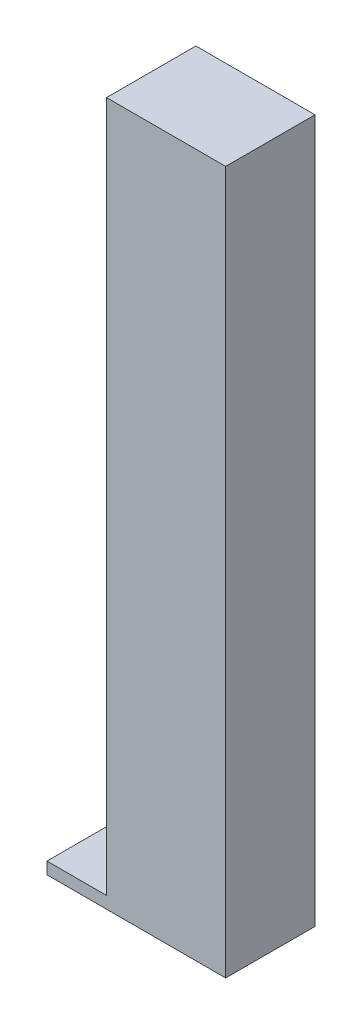
ISO-10303-21;
HEADER;
FILE_DESCRIPTION(('STEP AP214'),'2;1');
FILE_NAME('part.step','',(''),(''),'','','');
FILE_SCHEMA(('AUTOMOTIVE_DESIGN { 1 0 10303 214 1 1 1 1 }'));
ENDSEC;
DATA;
#1=APPLICATION_CONTEXT('core data for automotive mechanical design processes');
#2=APPLICATION_PROTOCOL_DEFINITION('international standard','automotive_design',2000,#1);
#3=PRODUCT_CONTEXT('',#1,'mechanical');
#4=PRODUCT('Part','Part','',(#3));
#5=PRODUCT_RELATED_PRODUCT_CATEGORY('part','',(#4));
#6=PRODUCT_DEFINITION_FORMATION('','',#4);
#7=PRODUCT_DEFINITION_CONTEXT('part definition',#1,'design');
#8=PRODUCT_DEFINITION('design','',#6,#7);
#9=PRODUCT_DEFINITION_SHAPE('','',#8);
#10=(LENGTH_UNIT() NAMED_UNIT(*) SI_UNIT(.MILLI.,.METRE.));
#11=(NAMED_UNIT(*) PLANE_ANGLE_UNIT() SI_UNIT($,.RADIAN.));
#12=(NAMED_UNIT(*) SI_UNIT($,.STERADIAN.) SOLID_ANGLE_UNIT());
#13=UNCERTAINTY_MEASURE_WITH_UNIT(LENGTH_MEASURE(1.E-05),#10,'distance_accuracy_value','');
#14=(GEOMETRIC_REPRESENTATION_CONTEXT(3) GLOBAL_UNCERTAINTY_ASSIGNED_CONTEXT((#13)) GLOBAL_UNIT_ASSIGNED_CONTEXT((#10,
#11,#12)) REPRESENTATION_CONTEXT('',''));
#15=CARTESIAN_POINT('',(0.,0.,0.));
#16=DIRECTION('',(0.,0.,1.));
#17=DIRECTION('',(1.,0.,0.));
#18=AXIS2_PLACEMENT_3D('',#15,#16,#17);
#19=CARTESIAN_POINT('',(9.99999999999999,115.,10.0733136779396));
#20=DIRECTION('',(-1.,0.,0.));
#21=DIRECTION('',(0.,0.,1.));
#22=AXIS2_PLACEMENT_3D('',#19,#20,#21);
#23=PLANE('',#22);
#24=DIRECTION('',(0.,-1.,0.));
#25=VECTOR('',#24,1.);
#26=CARTESIAN_POINT('',(9.99999999999999,115.,10.0733136779396));
#27=LINE('',#26,#25);
#28=CARTESIAN_POINT('',(9.99999999999999,116.,10.0733136779396));
#29=VERTEX_POINT('',#28);
#30=CARTESIAN_POINT('',(9.99999999999999,-2.,10.0733136779396));
#31=VERTEX_POINT('',#30);
#32=EDGE_CURVE('E178',#29,#31,#27,.T.);
#33=ORIENTED_EDGE('',*,*,#32,.T.);
#34=DIRECTION('',(0.,0.,1.));
#35=VECTOR('',#34,1.);
#36=CARTESIAN_POINT('',(9.99999999999999,-2.,-4.92668632206039));
#37=LINE('',#36,#35);
#38=CARTESIAN_POINT('',(9.99999999999999,-2.,-4.92668632206039));
#39=VERTEX_POINT('',#38);
#40=EDGE_CURVE('E181',#39,#31,#37,.T.);
#41=ORIENTED_EDGE('',*,*,#40,.F.);
#42=DIRECTION('',(0.,-1.,0.));
#43=VECTOR('',#42,1.);
#44=CARTESIAN_POINT('',(9.99999999999999,115.,-4.92668632206039));
#45=LINE('',#44,#43);
#46=CARTESIAN_POINT('',(9.99999999999999,116.,-4.92668632206039));
#47=VERTEX_POINT('',#46);
#48=EDGE_CURVE('E11',#47,#39,#45,.T.);
#49=ORIENTED_EDGE('',*,*,#48,.F.);
#50=DIRECTION('',(0.,0.,-1.));
#51=VECTOR('',#50,1.);
#52=CARTESIAN_POINT('',(9.99999999999999,116.,10.0733136779396));
#53=LINE('',#52,#51);
#54=EDGE_CURVE('E183',#29,#47,#53,.T.);
#55=ORIENTED_EDGE('',*,*,#54,.F.);
#56=EDGE_LOOP('',(#33,#41,#49,#55));
#57=FACE_BOUND('',#56,.T.);
#58=ADVANCED_FACE('F32',(#57),#23,.F.);
#59=CARTESIAN_POINT('',(-10.,115.,-4.92668632206039));
#60=DIRECTION('',(0.,0.,1.));
#61=DIRECTION('',(1.,0.,0.));
#62=AXIS2_PLACEMENT_3D('',#59,#60,#61);
#63=PLANE('',#62);
#64=ORIENTED_EDGE('',*,*,#48,.T.);
#65=DIRECTION('',(1.,0.,0.));
#66=VECTOR('',#65,1.);
#67=CARTESIAN_POINT('',(9.99999999999999,-2.,-4.92668632206039));
#68=LINE('',#67,#66);
#69=CARTESIAN_POINT('',(-20.,-2.,-4.92668632206039));
#70=VERTEX_POINT('',#69);
#71=EDGE_CURVE('E203',#70,#39,#68,.T.);
#72=ORIENTED_EDGE('',*,*,#71,.F.);
#73=DIRECTION('',(0.,1.,0.));
#74=VECTOR('',#73,1.);
#75=CARTESIAN_POINT('',(-20.,-2.,-4.92668632206039));
#76=LINE('',#75,#74);
#77=CARTESIAN_POINT('',(-20.,0.,-4.92668632206039));
#78=VERTEX_POINT('',#77);
#79=EDGE_CURVE('E212',#70,#78,#76,.T.);
#80=ORIENTED_EDGE('',*,*,#79,.T.);
#81=DIRECTION('',(1.,0.,0.));
#82=VECTOR('',#81,1.);
#83=CARTESIAN_POINT('',(9.99999999999999,0.,-4.92668632206039));
#84=LINE('',#83,#82);
#85=CARTESIAN_POINT('',(-10.,0.,-4.92668632206039));
#86=VERTEX_POINT('',#85);
#87=EDGE_CURVE('E204',#78,#86,#84,.T.);
#88=ORIENTED_EDGE('',*,*,#87,.T.);
#89=DIRECTION('',(0.,-1.,0.));
#90=VECTOR('',#89,1.);
#91=CARTESIAN_POINT('',(-10.,115.,-4.92668632206039));
#92=LINE('',#91,#90);
#93=CARTESIAN_POINT('',(-10.,116.,-4.92668632206039));
#94=VERTEX_POINT('',#93);
#95=EDGE_CURVE('E41',#94,#86,#92,.T.);
#96=ORIENTED_EDGE('',*,*,#95,.F.);
#97=DIRECTION('',(-1.,0.,0.));
#98=VECTOR('',#97,1.);
#99=CARTESIAN_POINT('',(-10.,116.,-4.92668632206039));
#100=LINE('',#99,#98);
#101=EDGE_CURVE('E227',#47,#94,#100,.T.);
#102=ORIENTED_EDGE('',*,*,#101,.F.);
#103=EDGE_LOOP('',(#64,#72,#80,#88,#96,#102));
#104=FACE_BOUND('',#103,.T.);
#105=ADVANCED_FACE('F411',(#104),#63,.F.);
#106=CARTESIAN_POINT('',(-7.00000000000001,115.,-0.926686322060391));
#107=DIRECTION('',(0.,0.,-1.));
#108=DIRECTION('',(-1.,0.,0.));
#109=AXIS2_PLACEMENT_3D('',#106,#107,#108);
#110=PLANE('',#109);
#111=DIRECTION('',(1.,0.,0.));
#112=VECTOR('',#111,1.);
#113=CARTESIAN_POINT('',(-7.00000000000001,0.,-0.926686322060391));
#114=LINE('',#113,#112);
#115=CARTESIAN_POINT('',(-10.,0.,-0.92668632206039));
#116=VERTEX_POINT('',#115);
#117=CARTESIAN_POINT('',(-7.00000000000001,0.,-0.926686322060391));
#118=VERTEX_POINT('',#117);
#119=EDGE_CURVE('E277',#116,#118,#114,.T.);
#120=ORIENTED_EDGE('',*,*,#119,.T.);
#121=DIRECTION('',(0.,-1.,0.));
#122=VECTOR('',#121,1.);
#123=CARTESIAN_POINT('',(-7.00000000000001,115.,-0.926686322060391));
#124=LINE('',#123,#122);
#125=CARTESIAN_POINT('',(-7.00000000000001,115.,-0.926686322060391));
#126=VERTEX_POINT('',#125);
#127=EDGE_CURVE('E288',#126,#118,#124,.T.);
#128=ORIENTED_EDGE('',*,*,#127,.F.);
#129=DIRECTION('',(1.,0.,0.));
#130=VECTOR('',#129,1.);
#131=CARTESIAN_POINT('',(-7.00000000000001,115.,-0.926686322060391));
#132=LINE('',#131,#130);
#133=CARTESIAN_POINT('',(-10.,115.,-0.92668632206039));
#134=VERTEX_POINT('',#133);
#135=EDGE_CURVE('E239',#134,#126,#132,.T.);
#136=ORIENTED_EDGE('',*,*,#135,.F.);
#137=DIRECTION('',(0.,-1.,0.));
#138=VECTOR('',#137,1.);
#139=CARTESIAN_POINT('',(-10.,115.,-0.92668632206039));
#140=LINE('',#139,#138);
#141=EDGE_CURVE('E285',#134,#116,#140,.T.);
#142=ORIENTED_EDGE('',*,*,#141,.T.);
#143=EDGE_LOOP('',(#120,#128,#136,#142));
#144=FACE_BOUND('',#143,.T.);
#145=ADVANCED_FACE('F400',(#144),#110,.F.);
#146=CARTESIAN_POINT('',(-7.00000000000001,115.,-2.92668632206039));
#147=DIRECTION('',(-1.,0.,0.));
#148=DIRECTION('',(0.,0.,1.));
#149=AXIS2_PLACEMENT_3D('',#146,#147,#148);
#150=PLANE('',#149);
#151=DIRECTION('',(0.,0.,-1.));
#152=VECTOR('',#151,1.);
#153=CARTESIAN_POINT('',(-7.00000000000001,0.,-2.92668632206039));
#154=LINE('',#153,#152);
#155=CARTESIAN_POINT('',(-7.00000000000001,0.,-2.92668632206039));
#156=VERTEX_POINT('',#155);
#157=EDGE_CURVE('E394',#118,#156,#154,.T.);
#158=ORIENTED_EDGE('',*,*,#157,.T.);
#159=DIRECTION('',(0.,-1.,0.));
#160=VECTOR('',#159,1.);
#161=CARTESIAN_POINT('',(-7.00000000000001,115.,-2.92668632206039));
#162=LINE('',#161,#160);
#163=CARTESIAN_POINT('',(-7.00000000000001,115.,-2.92668632206039));
#164=VERTEX_POINT('',#163);
#165=EDGE_CURVE('E346',#164,#156,#162,.T.);
#166=ORIENTED_EDGE('',*,*,#165,.F.);
#167=DIRECTION('',(0.,0.,-1.));
#168=VECTOR('',#167,1.);
#169=CARTESIAN_POINT('',(-7.00000000000001,115.,-2.92668632206039));
#170=LINE('',#169,#168);
#171=EDGE_CURVE('E235',#126,#164,#170,.T.);
#172=ORIENTED_EDGE('',*,*,#171,.F.);
#173=ORIENTED_EDGE('',*,*,#127,.T.);
#174=EDGE_LOOP('',(#158,#166,#172,#173));
#175=FACE_BOUND('',#174,.T.);
#176=ADVANCED_FACE('F403',(#175),#150,.F.);
#177=CARTESIAN_POINT('',(-7.00000000000001,115.,-2.92668632206039));
#178=DIRECTION('',(0.,0.,-1.));
#179=DIRECTION('',(-1.,0.,0.));
#180=AXIS2_PLACEMENT_3D('',#177,#178,#179);
#181=PLANE('',#180);
#182=DIRECTION('',(1.,0.,0.));
#183=VECTOR('',#182,1.);
#184=CARTESIAN_POINT('',(-7.00000000000001,0.,-2.92668632206039));
#185=LINE('',#184,#183);
#186=CARTESIAN_POINT('',(0.,0.,-2.92668632206039));
#187=VERTEX_POINT('',#186);
#188=EDGE_CURVE('E392',#156,#187,#185,.T.);
#189=ORIENTED_EDGE('',*,*,#188,.T.);
#190=DIRECTION('',(0.,-1.,0.));
#191=VECTOR('',#190,1.);
#192=CARTESIAN_POINT('',(0.,115.,-2.92668632206039));
#193=LINE('',#192,#191);
#194=CARTESIAN_POINT('',(0.,115.,-2.92668632206039));
#195=VERTEX_POINT('',#194);
#196=EDGE_CURVE('E343',#195,#187,#193,.T.);
#197=ORIENTED_EDGE('',*,*,#196,.F.);
#198=DIRECTION('',(1.,0.,0.));
#199=VECTOR('',#198,1.);
#200=CARTESIAN_POINT('',(-7.00000000000001,115.,-2.92668632206039));
#201=LINE('',#200,#199);
#202=EDGE_CURVE('E238',#164,#195,#201,.T.);
#203=ORIENTED_EDGE('',*,*,#202,.F.);
#204=ORIENTED_EDGE('',*,*,#165,.T.);
#205=EDGE_LOOP('',(#189,#197,#203,#204));
#206=FACE_BOUND('',#205,.T.);
#207=ADVANCED_FACE('F440',(#206),#181,.F.);
#208=CARTESIAN_POINT('',(0.,115.,-2.92668632206039));
#209=DIRECTION('',(-1.,0.,0.));
#210=DIRECTION('',(0.,0.,1.));
#211=AXIS2_PLACEMENT_3D('',#208,#209,#210);
#212=PLANE('',#211);
#213=DIRECTION('',(0.,0.,-1.));
#214=VECTOR('',#213,1.);
#215=CARTESIAN_POINT('',(0.,0.,-2.92668632206039));
#216=LINE('',#215,#214);
#217=CARTESIAN_POINT('',(0.,0.,-3.92668632206039));
#218=VERTEX_POINT('',#217);
#219=EDGE_CURVE('E389',#187,#218,#216,.T.);
#220=ORIENTED_EDGE('',*,*,#219,.T.);
#221=DIRECTION('',(0.,-1.,0.));
#222=VECTOR('',#221,1.);
#223=CARTESIAN_POINT('',(0.,115.,-3.92668632206039));
#224=LINE('',#223,#222);
#225=CARTESIAN_POINT('',(0.,115.,-3.92668632206039));
#226=VERTEX_POINT('',#225);
#227=EDGE_CURVE('E340',#226,#218,#224,.T.);
#228=ORIENTED_EDGE('',*,*,#227,.F.);
#229=DIRECTION('',(0.,0.,-1.));
#230=VECTOR('',#229,1.);
#231=CARTESIAN_POINT('',(0.,115.,-2.92668632206039));
#232=LINE('',#231,#230);
#233=EDGE_CURVE('E242',#195,#226,#232,.T.);
#234=ORIENTED_EDGE('',*,*,#233,.F.);
#235=ORIENTED_EDGE('',*,*,#196,.T.);
#236=EDGE_LOOP('',(#220,#228,#234,#235));
#237=FACE_BOUND('',#236,.T.);
#238=ADVANCED_FACE('F443',(#237),#212,.F.);
#239=CARTESIAN_POINT('',(0.,115.,-3.92668632206039));
#240=DIRECTION('',(0.,0.,-1.));
#241=DIRECTION('',(-1.,0.,0.));
#242=AXIS2_PLACEMENT_3D('',#239,#240,#241);
#243=PLANE('',#242);
#244=DIRECTION('',(1.,0.,0.));
#245=VECTOR('',#244,1.);
#246=CARTESIAN_POINT('',(0.,0.,-3.92668632206039));
#247=LINE('',#246,#245);
#248=CARTESIAN_POINT('',(1.,0.,-3.92668632206039));
#249=VERTEX_POINT('',#248);
#250=EDGE_CURVE('E386',#218,#249,#247,.T.);
#251=ORIENTED_EDGE('',*,*,#250,.T.);
#252=DIRECTION('',(0.,-1.,0.));
#253=VECTOR('',#252,1.);
#254=CARTESIAN_POINT('',(1.,115.,-3.92668632206039));
#255=LINE('',#254,#253);
#256=CARTESIAN_POINT('',(1.,115.,-3.92668632206039));
#257=VERTEX_POINT('',#256);
#258=EDGE_CURVE('E337',#257,#249,#255,.T.);
#259=ORIENTED_EDGE('',*,*,#258,.F.);
#260=DIRECTION('',(1.,0.,0.));
#261=VECTOR('',#260,1.);
#262=CARTESIAN_POINT('',(0.,115.,-3.92668632206039));
#263=LINE('',#262,#261);
#264=EDGE_CURVE('E245',#226,#257,#263,.T.);
#265=ORIENTED_EDGE('',*,*,#264,.F.);
#266=ORIENTED_EDGE('',*,*,#227,.T.);
#267=EDGE_LOOP('',(#251,#259,#265,#266));
#268=FACE_BOUND('',#267,.T.);
#269=ADVANCED_FACE('F447',(#268),#243,.F.);
#270=CARTESIAN_POINT('',(1.,115.,-3.92668632206039));
#271=DIRECTION('',(1.,0.,0.));
#272=DIRECTION('',(0.,0.,-1.));
#273=AXIS2_PLACEMENT_3D('',#270,#271,#272);
#274=PLANE('',#273);
#275=DIRECTION('',(0.,0.,1.));
#276=VECTOR('',#275,1.);
#277=CARTESIAN_POINT('',(1.,0.,-3.92668632206039));
#278=LINE('',#277,#276);
#279=CARTESIAN_POINT('',(1.,0.,-2.92668632206039));
#280=VERTEX_POINT('',#279);
#281=EDGE_CURVE('E383',#249,#280,#278,.T.);
#282=ORIENTED_EDGE('',*,*,#281,.T.);
#283=DIRECTION('',(0.,-1.,0.));
#284=VECTOR('',#283,1.);
#285=CARTESIAN_POINT('',(1.,115.,-2.92668632206039));
#286=LINE('',#285,#284);
#287=CARTESIAN_POINT('',(1.,115.,-2.92668632206039));
#288=VERTEX_POINT('',#287);
#289=EDGE_CURVE('E334',#288,#280,#286,.T.);
#290=ORIENTED_EDGE('',*,*,#289,.F.);
#291=DIRECTION('',(0.,0.,1.));
#292=VECTOR('',#291,1.);
#293=CARTESIAN_POINT('',(1.,115.,-3.92668632206039));
#294=LINE('',#293,#292);
#295=EDGE_CURVE('E248',#257,#288,#294,.T.);
#296=ORIENTED_EDGE('',*,*,#295,.F.);
#297=ORIENTED_EDGE('',*,*,#258,.T.);
#298=EDGE_LOOP('',(#282,#290,#296,#297));
#299=FACE_BOUND('',#298,.T.);
#300=ADVANCED_FACE('F451',(#299),#274,.F.);
#301=CARTESIAN_POINT('',(1.,115.,-2.92668632206039));
#302=DIRECTION('',(0.,0.,-1.));
#303=DIRECTION('',(-1.,0.,0.));
#304=AXIS2_PLACEMENT_3D('',#301,#302,#303);
#305=PLANE('',#304);
#306=DIRECTION('',(1.,0.,0.));
#307=VECTOR('',#306,1.);
#308=CARTESIAN_POINT('',(1.,0.,-2.92668632206039));
#309=LINE('',#308,#307);
#310=CARTESIAN_POINT('',(8.,0.,-2.92668632206039));
#311=VERTEX_POINT('',#310);
#312=EDGE_CURVE('E380',#280,#311,#309,.T.);
#313=ORIENTED_EDGE('',*,*,#312,.T.);
#314=DIRECTION('',(0.,-1.,0.));
#315=VECTOR('',#314,1.);
#316=CARTESIAN_POINT('',(8.,115.,-2.92668632206039));
#317=LINE('',#316,#315);
#318=CARTESIAN_POINT('',(8.,115.,-2.92668632206039));
#319=VERTEX_POINT('',#318);
#320=EDGE_CURVE('E331',#319,#311,#317,.T.);
#321=ORIENTED_EDGE('',*,*,#320,.F.);
#322=DIRECTION('',(1.,0.,0.));
#323=VECTOR('',#322,1.);
#324=CARTESIAN_POINT('',(1.,115.,-2.92668632206039));
#325=LINE('',#324,#323);
#326=EDGE_CURVE('E251',#288,#319,#325,.T.);
#327=ORIENTED_EDGE('',*,*,#326,.F.);
#328=ORIENTED_EDGE('',*,*,#289,.T.);
#329=EDGE_LOOP('',(#313,#321,#327,#328));
#330=FACE_BOUND('',#329,.T.);
#331=ADVANCED_FACE('F455',(#330),#305,.F.);
#332=CARTESIAN_POINT('',(8.,115.,8.07331367793961));
#333=DIRECTION('',(1.,0.,0.));
#334=DIRECTION('',(0.,0.,-1.));
#335=AXIS2_PLACEMENT_3D('',#332,#333,#334);
#336=PLANE('',#335);
#337=DIRECTION('',(0.,0.,1.));
#338=VECTOR('',#337,1.);
#339=CARTESIAN_POINT('',(8.,0.,8.07331367793961));
#340=LINE('',#339,#338);
#341=CARTESIAN_POINT('',(8.,0.,8.07331367793961));
#342=VERTEX_POINT('',#341);
#343=EDGE_CURVE('E377',#311,#342,#340,.T.);
#344=ORIENTED_EDGE('',*,*,#343,.T.);
#345=DIRECTION('',(0.,-1.,0.));
#346=VECTOR('',#345,1.);
#347=CARTESIAN_POINT('',(8.,115.,8.07331367793961));
#348=LINE('',#347,#346);
#349=CARTESIAN_POINT('',(8.,115.,8.07331367793961));
#350=VERTEX_POINT('',#349);
#351=EDGE_CURVE('E328',#350,#342,#348,.T.);
#352=ORIENTED_EDGE('',*,*,#351,.F.);
#353=DIRECTION('',(0.,0.,1.));
#354=VECTOR('',#353,1.);
#355=CARTESIAN_POINT('',(8.,115.,8.07331367793961));
#356=LINE('',#355,#354);
#357=EDGE_CURVE('E254',#319,#350,#356,.T.);
#358=ORIENTED_EDGE('',*,*,#357,.F.);
#359=ORIENTED_EDGE('',*,*,#320,.T.);
#360=EDGE_LOOP('',(#344,#352,#358,#359));
#361=FACE_BOUND('',#360,.T.);
#362=ADVANCED_FACE('F459',(#361),#336,.F.);
#363=CARTESIAN_POINT('',(0.999999999999993,115.,8.07331367793961));
#364=DIRECTION('',(0.,0.,1.));
#365=DIRECTION('',(1.,0.,0.));
#366=AXIS2_PLACEMENT_3D('',#363,#364,#365);
#367=PLANE('',#366);
#368=DIRECTION('',(-1.,0.,0.));
#369=VECTOR('',#368,1.);
#370=CARTESIAN_POINT('',(0.999999999999993,0.,8.07331367793961));
#371=LINE('',#370,#369);
#372=CARTESIAN_POINT('',(0.999999999999993,0.,8.07331367793961));
#373=VERTEX_POINT('',#372);
#374=EDGE_CURVE('E374',#342,#373,#371,.T.);
#375=ORIENTED_EDGE('',*,*,#374,.T.);
#376=DIRECTION('',(0.,-1.,0.));
#377=VECTOR('',#376,1.);
#378=CARTESIAN_POINT('',(0.999999999999993,115.,8.07331367793961));
#379=LINE('',#378,#377);
#380=CARTESIAN_POINT('',(0.999999999999993,115.,8.07331367793961));
#381=VERTEX_POINT('',#380);
#382=EDGE_CURVE('E325',#381,#373,#379,.T.);
#383=ORIENTED_EDGE('',*,*,#382,.F.);
#384=DIRECTION('',(-1.,0.,0.));
#385=VECTOR('',#384,1.);
#386=CARTESIAN_POINT('',(0.999999999999993,115.,8.07331367793961));
#387=LINE('',#386,#385);
#388=EDGE_CURVE('E257',#350,#381,#387,.T.);
#389=ORIENTED_EDGE('',*,*,#388,.F.);
#390=ORIENTED_EDGE('',*,*,#351,.T.);
#391=EDGE_LOOP('',(#375,#383,#389,#390));
#392=FACE_BOUND('',#391,.T.);
#393=ADVANCED_FACE('F463',(#392),#367,.F.);
#394=CARTESIAN_POINT('',(0.999999999999993,115.,9.07331367793961));
#395=DIRECTION('',(1.,0.,0.));
#396=DIRECTION('',(0.,0.,-1.));
#397=AXIS2_PLACEMENT_3D('',#394,#395,#396);
#398=PLANE('',#397);
#399=DIRECTION('',(0.,0.,1.));
#400=VECTOR('',#399,1.);
#401=CARTESIAN_POINT('',(0.999999999999993,0.,9.07331367793961));
#402=LINE('',#401,#400);
#403=CARTESIAN_POINT('',(0.999999999999993,0.,9.07331367793961));
#404=VERTEX_POINT('',#403);
#405=EDGE_CURVE('E371',#373,#404,#402,.T.);
#406=ORIENTED_EDGE('',*,*,#405,.T.);
#407=DIRECTION('',(0.,-1.,0.));
#408=VECTOR('',#407,1.);
#409=CARTESIAN_POINT('',(0.999999999999993,115.,9.07331367793961));
#410=LINE('',#409,#408);
#411=CARTESIAN_POINT('',(0.999999999999993,115.,9.07331367793961));
#412=VERTEX_POINT('',#411);
#413=EDGE_CURVE('E322',#412,#404,#410,.T.);
#414=ORIENTED_EDGE('',*,*,#413,.F.);
#415=DIRECTION('',(0.,0.,1.));
#416=VECTOR('',#415,1.);
#417=CARTESIAN_POINT('',(0.999999999999993,115.,9.07331367793961));
#418=LINE('',#417,#416);
#419=EDGE_CURVE('E260',#381,#412,#418,.T.);
#420=ORIENTED_EDGE('',*,*,#419,.F.);
#421=ORIENTED_EDGE('',*,*,#382,.T.);
#422=EDGE_LOOP('',(#406,#414,#420,#421));
#423=FACE_BOUND('',#422,.T.);
#424=ADVANCED_FACE('F467',(#423),#398,.F.);
#425=CARTESIAN_POINT('',(0.,115.,9.07331367793961));
#426=DIRECTION('',(0.,0.,1.));
#427=DIRECTION('',(1.,0.,0.));
#428=AXIS2_PLACEMENT_3D('',#425,#426,#427);
#429=PLANE('',#428);
#430=DIRECTION('',(-1.,0.,0.));
#431=VECTOR('',#430,1.);
#432=CARTESIAN_POINT('',(0.,0.,9.07331367793961));
#433=LINE('',#432,#431);
#434=CARTESIAN_POINT('',(0.,0.,9.07331367793961));
#435=VERTEX_POINT('',#434);
#436=EDGE_CURVE('E368',#404,#435,#433,.T.);
#437=ORIENTED_EDGE('',*,*,#436,.T.);
#438=DIRECTION('',(0.,-1.,0.));
#439=VECTOR('',#438,1.);
#440=CARTESIAN_POINT('',(0.,115.,9.07331367793961));
#441=LINE('',#440,#439);
#442=CARTESIAN_POINT('',(0.,115.,9.07331367793961));
#443=VERTEX_POINT('',#442);
#444=EDGE_CURVE('E319',#443,#435,#441,.T.);
#445=ORIENTED_EDGE('',*,*,#444,.F.);
#446=DIRECTION('',(-1.,0.,0.));
#447=VECTOR('',#446,1.);
#448=CARTESIAN_POINT('',(0.,115.,9.07331367793961));
#449=LINE('',#448,#447);
#450=EDGE_CURVE('E263',#412,#443,#449,.T.);
#451=ORIENTED_EDGE('',*,*,#450,.F.);
#452=ORIENTED_EDGE('',*,*,#413,.T.);
#453=EDGE_LOOP('',(#437,#445,#451,#452));
#454=FACE_BOUND('',#453,.T.);
#455=ADVANCED_FACE('F471',(#454),#429,.F.);
#456=CARTESIAN_POINT('',(0.,115.,8.07331367793961));
#457=DIRECTION('',(-1.,0.,0.));
#458=DIRECTION('',(0.,0.,1.));
#459=AXIS2_PLACEMENT_3D('',#456,#457,#458);
#460=PLANE('',#459);
#461=DIRECTION('',(0.,0.,-1.));
#462=VECTOR('',#461,1.);
#463=CARTESIAN_POINT('',(0.,0.,8.07331367793961));
#464=LINE('',#463,#462);
#465=CARTESIAN_POINT('',(0.,0.,8.07331367793961));
#466=VERTEX_POINT('',#465);
#467=EDGE_CURVE('E363',#435,#466,#464,.T.);
#468=ORIENTED_EDGE('',*,*,#467,.T.);
#469=DIRECTION('',(0.,-1.,0.));
#470=VECTOR('',#469,1.);
#471=CARTESIAN_POINT('',(0.,115.,8.07331367793961));
#472=LINE('',#471,#470);
#473=CARTESIAN_POINT('',(0.,115.,8.07331367793961));
#474=VERTEX_POINT('',#473);
#475=EDGE_CURVE('E316',#474,#466,#472,.T.);
#476=ORIENTED_EDGE('',*,*,#475,.F.);
#477=DIRECTION('',(0.,0.,-1.));
#478=VECTOR('',#477,1.);
#479=CARTESIAN_POINT('',(0.,115.,8.07331367793961));
#480=LINE('',#479,#478);
#481=EDGE_CURVE('E266',#443,#474,#480,.T.);
#482=ORIENTED_EDGE('',*,*,#481,.F.);
#483=ORIENTED_EDGE('',*,*,#444,.T.);
#484=EDGE_LOOP('',(#468,#476,#482,#483));
#485=FACE_BOUND('',#484,.T.);
#486=ADVANCED_FACE('F475',(#485),#460,.F.);
#487=CARTESIAN_POINT('',(-7.00000000000001,115.,8.07331367793961));
#488=DIRECTION('',(0.,0.,1.));
#489=DIRECTION('',(1.,0.,0.));
#490=AXIS2_PLACEMENT_3D('',#487,#488,#489);
#491=PLANE('',#490);
#492=DIRECTION('',(-1.,0.,0.));
#493=VECTOR('',#492,1.);
#494=CARTESIAN_POINT('',(-7.00000000000001,0.,8.07331367793961));
#495=LINE('',#494,#493);
#496=CARTESIAN_POINT('',(-7.00000000000001,0.,8.07331367793961));
#497=VERTEX_POINT('',#496);
#498=EDGE_CURVE('E361',#466,#497,#495,.T.);
#499=ORIENTED_EDGE('',*,*,#498,.T.);
#500=DIRECTION('',(0.,-1.,0.));
#501=VECTOR('',#500,1.);
#502=CARTESIAN_POINT('',(-7.00000000000001,115.,8.07331367793961));
#503=LINE('',#502,#501);
#504=CARTESIAN_POINT('',(-7.00000000000001,115.,8.07331367793961));
#505=VERTEX_POINT('',#504);
#506=EDGE_CURVE('E312',#505,#497,#503,.T.);
#507=ORIENTED_EDGE('',*,*,#506,.F.);
#508=DIRECTION('',(-1.,0.,0.));
#509=VECTOR('',#508,1.);
#510=CARTESIAN_POINT('',(-7.00000000000001,115.,8.07331367793961));
#511=LINE('',#510,#509);
#512=EDGE_CURVE('E269',#474,#505,#511,.T.);
#513=ORIENTED_EDGE('',*,*,#512,.F.);
#514=ORIENTED_EDGE('',*,*,#475,.T.);
#515=EDGE_LOOP('',(#499,#507,#513,#514));
#516=FACE_BOUND('',#515,.T.);
#517=ADVANCED_FACE('F479',(#516),#491,.F.);
#518=CARTESIAN_POINT('',(-7.00000000000001,115.,6.07331367793961));
#519=DIRECTION('',(-1.,0.,0.));
#520=DIRECTION('',(0.,0.,1.));
#521=AXIS2_PLACEMENT_3D('',#518,#519,#520);
#522=PLANE('',#521);
#523=DIRECTION('',(0.,0.,-1.));
#524=VECTOR('',#523,1.);
#525=CARTESIAN_POINT('',(-7.00000000000001,0.,6.07331367793961));
#526=LINE('',#525,#524);
#527=CARTESIAN_POINT('',(-7.00000000000001,0.,6.07331367793961));
#528=VERTEX_POINT('',#527);
#529=EDGE_CURVE('E360',#497,#528,#526,.T.);
#530=ORIENTED_EDGE('',*,*,#529,.T.);
#531=DIRECTION('',(0.,-1.,0.));
#532=VECTOR('',#531,1.);
#533=CARTESIAN_POINT('',(-7.00000000000001,115.,6.07331367793961));
#534=LINE('',#533,#532);
#535=CARTESIAN_POINT('',(-7.00000000000001,115.,6.07331367793961));
#536=VERTEX_POINT('',#535);
#537=EDGE_CURVE('E49',#536,#528,#534,.T.);
#538=ORIENTED_EDGE('',*,*,#537,.F.);
#539=DIRECTION('',(0.,0.,-1.));
#540=VECTOR('',#539,1.);
#541=CARTESIAN_POINT('',(-7.00000000000001,115.,6.07331367793961));
#542=LINE('',#541,#540);
#543=EDGE_CURVE('E272',#505,#536,#542,.T.);
#544=ORIENTED_EDGE('',*,*,#543,.F.);
#545=ORIENTED_EDGE('',*,*,#506,.T.);
#546=EDGE_LOOP('',(#530,#538,#544,#545));
#547=FACE_BOUND('',#546,.T.);
#548=ADVANCED_FACE('F483',(#547),#522,.F.);
#549=CARTESIAN_POINT('',(-10.,115.,6.07331367793961));
#550=DIRECTION('',(0.,0.,1.));
#551=DIRECTION('',(1.,0.,0.));
#552=AXIS2_PLACEMENT_3D('',#549,#550,#551);
#553=PLANE('',#552);
#554=DIRECTION('',(-1.,0.,0.));
#555=VECTOR('',#554,1.);
#556=CARTESIAN_POINT('',(-10.,0.,6.07331367793961));
#557=LINE('',#556,#555);
#558=CARTESIAN_POINT('',(-10.,0.,6.07331367793961));
#559=VERTEX_POINT('',#558);
#560=EDGE_CURVE('E306',#528,#559,#557,.T.);
#561=ORIENTED_EDGE('',*,*,#560,.T.);
#562=DIRECTION('',(0.,-1.,0.));
#563=VECTOR('',#562,1.);
#564=CARTESIAN_POINT('',(-10.,115.,6.07331367793961));
#565=LINE('',#564,#563);
#566=CARTESIAN_POINT('',(-10.,115.,6.07331367793961));
#567=VERTEX_POINT('',#566);
#568=EDGE_CURVE('E313',#567,#559,#565,.T.);
#569=ORIENTED_EDGE('',*,*,#568,.F.);
#570=DIRECTION('',(-1.,0.,0.));
#571=VECTOR('',#570,1.);
#572=CARTESIAN_POINT('',(-10.,115.,6.07331367793961));
#573=LINE('',#572,#571);
#574=EDGE_CURVE('E188',#536,#567,#573,.T.);
#575=ORIENTED_EDGE('',*,*,#574,.F.);
#576=ORIENTED_EDGE('',*,*,#537,.T.);
#577=EDGE_LOOP('',(#561,#569,#575,#576));
#578=FACE_BOUND('',#577,.T.);
#579=ADVANCED_FACE('F359',(#578),#553,.F.);
#580=CARTESIAN_POINT('',(-10.,115.,10.0733136779396));
#581=DIRECTION('',(1.,0.,0.));
#582=DIRECTION('',(0.,0.,-1.));
#583=AXIS2_PLACEMENT_3D('',#580,#581,#582);
#584=PLANE('',#583);
#585=DIRECTION('',(0.,0.,1.));
#586=VECTOR('',#585,1.);
#587=CARTESIAN_POINT('',(-10.,0.,10.0733136779396));
#588=LINE('',#587,#586);
#589=CARTESIAN_POINT('',(-10.,0.,10.0733136779396));
#590=VERTEX_POINT('',#589);
#591=EDGE_CURVE('E293',#559,#590,#588,.T.);
#592=ORIENTED_EDGE('',*,*,#591,.T.);
#593=DIRECTION('',(0.,-1.,0.));
#594=VECTOR('',#593,1.);
#595=CARTESIAN_POINT('',(-10.,115.,10.0733136779396));
#596=LINE('',#595,#594);
#597=CARTESIAN_POINT('',(-10.,116.,10.0733136779396));
#598=VERTEX_POINT('',#597);
#599=EDGE_CURVE('E187',#598,#590,#596,.T.);
#600=ORIENTED_EDGE('',*,*,#599,.F.);
#601=DIRECTION('',(0.,0.,1.));
#602=VECTOR('',#601,1.);
#603=CARTESIAN_POINT('',(-10.,116.,10.0733136779396));
#604=LINE('',#603,#602);
#605=EDGE_CURVE('E220',#94,#598,#604,.T.);
#606=ORIENTED_EDGE('',*,*,#605,.F.);
#607=ORIENTED_EDGE('',*,*,#95,.T.);
#608=DIRECTION('',(0.,0.,1.));
#609=VECTOR('',#608,1.);
#610=CARTESIAN_POINT('',(-10.,0.,-4.92668632206039));
#611=LINE('',#610,#609);
#612=EDGE_CURVE('E230',#86,#116,#611,.T.);
#613=ORIENTED_EDGE('',*,*,#612,.T.);
#614=ORIENTED_EDGE('',*,*,#141,.F.);
#615=DIRECTION('',(0.,0.,1.));
#616=VECTOR('',#615,1.);
#617=CARTESIAN_POINT('',(-10.,115.,10.0733136779396));
#618=LINE('',#617,#616);
#619=EDGE_CURVE('E224',#134,#567,#618,.T.);
#620=ORIENTED_EDGE('',*,*,#619,.T.);
#621=ORIENTED_EDGE('',*,*,#568,.T.);
#622=EDGE_LOOP('',(#592,#600,#606,#607,#613,#614,#620,#621));
#623=FACE_BOUND('',#622,.T.);
#624=ADVANCED_FACE('F353',(#623),#584,.F.);
#625=CARTESIAN_POINT('',(-10.,115.,10.0733136779396));
#626=DIRECTION('',(0.,0.,-1.));
#627=DIRECTION('',(-1.,0.,0.));
#628=AXIS2_PLACEMENT_3D('',#625,#626,#627);
#629=PLANE('',#628);
#630=ORIENTED_EDGE('',*,*,#599,.T.);
#631=DIRECTION('',(-1.,0.,0.));
#632=VECTOR('',#631,1.);
#633=CARTESIAN_POINT('',(9.99999999999999,0.,10.0733136779396));
#634=LINE('',#633,#632);
#635=CARTESIAN_POINT('',(-20.,0.,10.0733136779396));
#636=VERTEX_POINT('',#635);
#637=EDGE_CURVE('E217',#590,#636,#634,.T.);
#638=ORIENTED_EDGE('',*,*,#637,.T.);
#639=DIRECTION('',(0.,1.,0.));
#640=VECTOR('',#639,1.);
#641=CARTESIAN_POINT('',(-20.,-2.,10.0733136779396));
#642=LINE('',#641,#640);
#643=CARTESIAN_POINT('',(-20.,-2.,10.0733136779396));
#644=VERTEX_POINT('',#643);
#645=EDGE_CURVE('E195',#644,#636,#642,.T.);
#646=ORIENTED_EDGE('',*,*,#645,.F.);
#647=DIRECTION('',(-1.,0.,0.));
#648=VECTOR('',#647,1.);
#649=CARTESIAN_POINT('',(9.99999999999999,-2.,10.0733136779396));
#650=LINE('',#649,#648);
#651=EDGE_CURVE('E191',#31,#644,#650,.T.);
#652=ORIENTED_EDGE('',*,*,#651,.F.);
#653=ORIENTED_EDGE('',*,*,#32,.F.);
#654=DIRECTION('',(1.,0.,0.));
#655=VECTOR('',#654,1.);
#656=CARTESIAN_POINT('',(-10.,116.,10.0733136779396));
#657=LINE('',#656,#655);
#658=EDGE_CURVE('E223',#598,#29,#657,.T.);
#659=ORIENTED_EDGE('',*,*,#658,.F.);
#660=EDGE_LOOP('',(#630,#638,#646,#652,#653,#659));
#661=FACE_BOUND('',#660,.T.);
#662=ADVANCED_FACE('F193',(#661),#629,.F.);
#663=CARTESIAN_POINT('',(0.,116.,0.));
#664=DIRECTION('',(0.,-1.,0.));
#665=DIRECTION('',(0.,0.,-1.));
#666=AXIS2_PLACEMENT_3D('',#663,#664,#665);
#667=PLANE('',#666);
#668=ORIENTED_EDGE('',*,*,#605,.T.);
#669=ORIENTED_EDGE('',*,*,#658,.T.);
#670=ORIENTED_EDGE('',*,*,#54,.T.);
#671=ORIENTED_EDGE('',*,*,#101,.T.);
#672=EDGE_LOOP('',(#668,#669,#670,#671));
#673=FACE_BOUND('',#672,.T.);
#674=ADVANCED_FACE('F425',(#673),#667,.F.);
#675=CARTESIAN_POINT('',(0.,115.,0.));
#676=DIRECTION('',(0.,-1.,0.));
#677=DIRECTION('',(0.,0.,-1.));
#678=AXIS2_PLACEMENT_3D('',#675,#676,#677);
#679=PLANE('',#678);
#680=ORIENTED_EDGE('',*,*,#619,.F.);
#681=ORIENTED_EDGE('',*,*,#135,.T.);
#682=ORIENTED_EDGE('',*,*,#171,.T.);
#683=ORIENTED_EDGE('',*,*,#202,.T.);
#684=ORIENTED_EDGE('',*,*,#233,.T.);
#685=ORIENTED_EDGE('',*,*,#264,.T.);
#686=ORIENTED_EDGE('',*,*,#295,.T.);
#687=ORIENTED_EDGE('',*,*,#326,.T.);
#688=ORIENTED_EDGE('',*,*,#357,.T.);
#689=ORIENTED_EDGE('',*,*,#388,.T.);
#690=ORIENTED_EDGE('',*,*,#419,.T.);
#691=ORIENTED_EDGE('',*,*,#450,.T.);
#692=ORIENTED_EDGE('',*,*,#481,.T.);
#693=ORIENTED_EDGE('',*,*,#512,.T.);
#694=ORIENTED_EDGE('',*,*,#543,.T.);
#695=ORIENTED_EDGE('',*,*,#574,.T.);
#696=EDGE_LOOP('',(#680,#681,#682,#683,#684,#685,#686,#687,#688,#689,#690,#691,#692,#693,#694,#695));
#697=FACE_BOUND('',#696,.T.);
#698=ADVANCED_FACE('F407',(#697),#679,.T.);
#699=CARTESIAN_POINT('',(-20.,-2.,-4.92668632206039));
#700=DIRECTION('',(1.,0.,0.));
#701=DIRECTION('',(0.,0.,-1.));
#702=AXIS2_PLACEMENT_3D('',#699,#700,#701);
#703=PLANE('',#702);
#704=DIRECTION('',(0.,0.,-1.));
#705=VECTOR('',#704,1.);
#706=CARTESIAN_POINT('',(-20.,0.,-4.92668632206039));
#707=LINE('',#706,#705);
#708=EDGE_CURVE('E207',#636,#78,#707,.T.);
#709=ORIENTED_EDGE('',*,*,#708,.T.);
#710=ORIENTED_EDGE('',*,*,#79,.F.);
#711=DIRECTION('',(0.,0.,-1.));
#712=VECTOR('',#711,1.);
#713=CARTESIAN_POINT('',(-20.,-2.,-4.92668632206039));
#714=LINE('',#713,#712);
#715=EDGE_CURVE('E198',#644,#70,#714,.T.);
#716=ORIENTED_EDGE('',*,*,#715,.F.);
#717=ORIENTED_EDGE('',*,*,#645,.T.);
#718=EDGE_LOOP('',(#709,#710,#716,#717));
#719=FACE_BOUND('',#718,.T.);
#720=ADVANCED_FACE('F417',(#719),#703,.F.);
#721=CARTESIAN_POINT('',(0.,-2.,0.));
#722=DIRECTION('',(0.,-1.,0.));
#723=DIRECTION('',(0.,0.,-1.));
#724=AXIS2_PLACEMENT_3D('',#721,#722,#723);
#725=PLANE('',#724);
#726=ORIENTED_EDGE('',*,*,#40,.T.);
#727=ORIENTED_EDGE('',*,*,#651,.T.);
#728=ORIENTED_EDGE('',*,*,#715,.T.);
#729=ORIENTED_EDGE('',*,*,#71,.T.);
#730=EDGE_LOOP('',(#726,#727,#728,#729));
#731=FACE_BOUND('',#730,.T.);
#732=ADVANCED_FACE('F201',(#731),#725,.T.);
#733=CARTESIAN_POINT('',(0.,0.,0.));
#734=DIRECTION('',(0.,-1.,0.));
#735=DIRECTION('',(0.,0.,-1.));
#736=AXIS2_PLACEMENT_3D('',#733,#734,#735);
#737=PLANE('',#736);
#738=ORIENTED_EDGE('',*,*,#591,.F.);
#739=ORIENTED_EDGE('',*,*,#560,.F.);
#740=ORIENTED_EDGE('',*,*,#529,.F.);
#741=ORIENTED_EDGE('',*,*,#498,.F.);
#742=ORIENTED_EDGE('',*,*,#467,.F.);
#743=ORIENTED_EDGE('',*,*,#436,.F.);
#744=ORIENTED_EDGE('',*,*,#405,.F.);
#745=ORIENTED_EDGE('',*,*,#374,.F.);
#746=ORIENTED_EDGE('',*,*,#343,.F.);
#747=ORIENTED_EDGE('',*,*,#312,.F.);
#748=ORIENTED_EDGE('',*,*,#281,.F.);
#749=ORIENTED_EDGE('',*,*,#250,.F.);
#750=ORIENTED_EDGE('',*,*,#219,.F.);
#751=ORIENTED_EDGE('',*,*,#188,.F.);
#752=ORIENTED_EDGE('',*,*,#157,.F.);
#753=ORIENTED_EDGE('',*,*,#119,.F.);
#754=ORIENTED_EDGE('',*,*,#612,.F.);
#755=ORIENTED_EDGE('',*,*,#87,.F.);
#756=ORIENTED_EDGE('',*,*,#708,.F.);
#757=ORIENTED_EDGE('',*,*,#637,.F.);
#758=EDGE_LOOP('',(#738,#739,#740,#741,#742,#743,#744,#745,#746,#747,#748,#749,#750,#751,#752,
#753,#754,#755,#756,#757));
#759=FACE_BOUND('',#758,.T.);
#760=ADVANCED_FACE('F356',(#759),#737,.F.);
#761=CLOSED_SHELL('',(#58,#105,#145,#176,#207,#238,#269,#300,#331,#362,#393,#424,#455,#486,#517,
#548,#579,#624,#662,#674,#698,#720,#732,#760));
#762=MANIFOLD_SOLID_BREP('B2',#761);
#763=ADVANCED_BREP_SHAPE_REPRESENTATION('',(#18,#762),#14);
#764=SHAPE_DEFINITION_REPRESENTATION(#9,#763);
ENDSEC;
END-ISO-10303-21;
